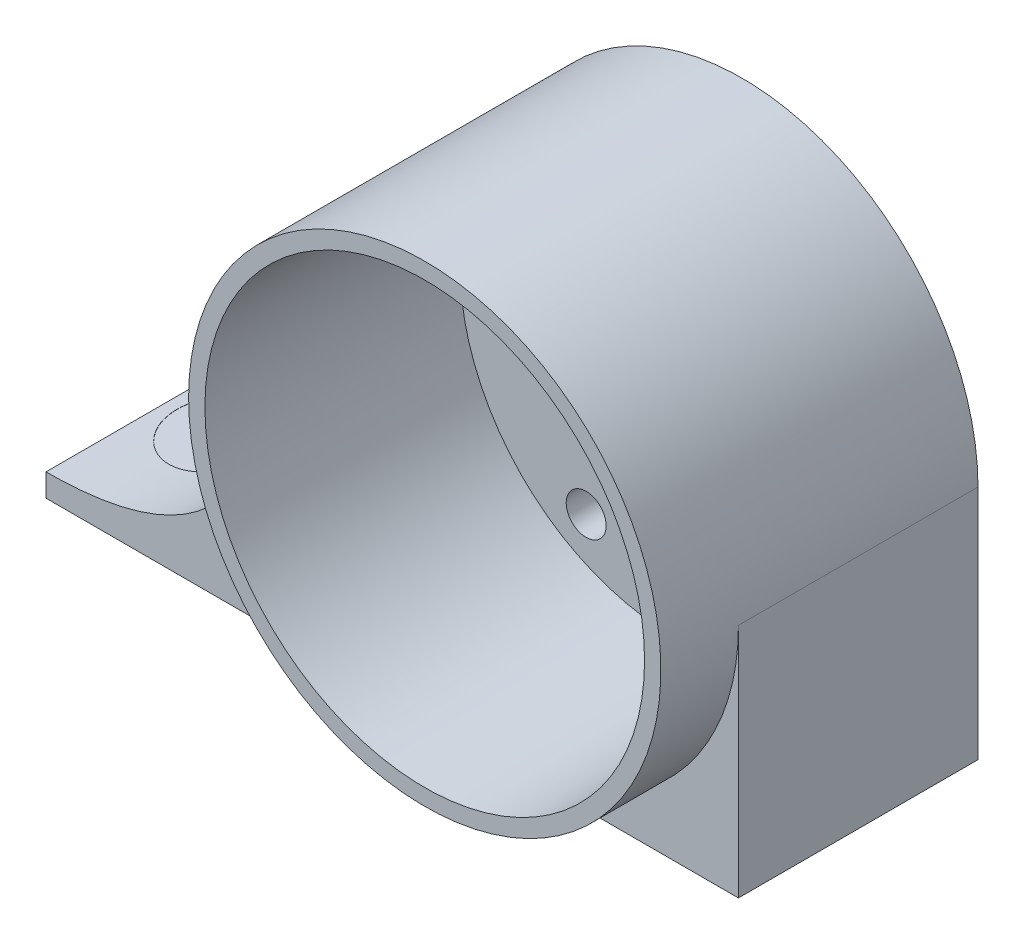
ISO-10303-21;
HEADER;
FILE_DESCRIPTION(('STEP AP214'),'2;1');
FILE_NAME('part.step','',(''),(''),'','','');
FILE_SCHEMA(('AUTOMOTIVE_DESIGN { 1 0 10303 214 1 1 1 1 }'));
ENDSEC;
DATA;
#1=APPLICATION_CONTEXT('core data for automotive mechanical design processes');
#2=APPLICATION_PROTOCOL_DEFINITION('international standard','automotive_design',2000,#1);
#3=PRODUCT_CONTEXT('',#1,'mechanical');
#4=PRODUCT('Part','Part','',(#3));
#5=PRODUCT_RELATED_PRODUCT_CATEGORY('part','',(#4));
#6=PRODUCT_DEFINITION_FORMATION('','',#4);
#7=PRODUCT_DEFINITION_CONTEXT('part definition',#1,'design');
#8=PRODUCT_DEFINITION('design','',#6,#7);
#9=PRODUCT_DEFINITION_SHAPE('','',#8);
#10=(LENGTH_UNIT() NAMED_UNIT(*) SI_UNIT(.MILLI.,.METRE.));
#11=(NAMED_UNIT(*) PLANE_ANGLE_UNIT() SI_UNIT($,.RADIAN.));
#12=(NAMED_UNIT(*) SI_UNIT($,.STERADIAN.) SOLID_ANGLE_UNIT());
#13=UNCERTAINTY_MEASURE_WITH_UNIT(LENGTH_MEASURE(1.E-05),#10,'distance_accuracy_value','');
#14=(GEOMETRIC_REPRESENTATION_CONTEXT(3) GLOBAL_UNCERTAINTY_ASSIGNED_CONTEXT((#13)) GLOBAL_UNIT_ASSIGNED_CONTEXT((#10,
#11,#12)) REPRESENTATION_CONTEXT('',''));
#15=CARTESIAN_POINT('',(0.,0.,0.));
#16=DIRECTION('',(0.,0.,1.));
#17=DIRECTION('',(1.,0.,0.));
#18=AXIS2_PLACEMENT_3D('',#15,#16,#17);
#19=CARTESIAN_POINT('',(7.64999999999997,13.2501886779019,6.));
#20=DIRECTION('',(0.,0.,-1.));
#21=DIRECTION('',(-1.,0.,0.));
#22=AXIS2_PLACEMENT_3D('',#19,#20,#21);
#23=CYLINDRICAL_SURFACE('',#22,1.75);
#24=CARTESIAN_POINT('',(7.64999999999997,13.2501886779019,6.));
#25=DIRECTION('',(0.,0.,1.));
#26=DIRECTION('',(-1.,0.,0.));
#27=AXIS2_PLACEMENT_3D('',#24,#25,#26);
#28=CIRCLE('',#27,1.75);
#29=CARTESIAN_POINT('',(5.89999999999997,13.2501886779019,6.));
#30=VERTEX_POINT('',#29);
#31=EDGE_CURVE('E151',#30,#30,#28,.T.);
#32=ORIENTED_EDGE('',*,*,#31,.T.);
#33=EDGE_LOOP('',(#32));
#34=FACE_BOUND('',#33,.T.);
#35=CARTESIAN_POINT('',(7.64999999999997,13.2501886779019,1.5));
#36=DIRECTION('',(0.,0.,-1.));
#37=DIRECTION('',(-1.,0.,0.));
#38=AXIS2_PLACEMENT_3D('',#35,#36,#37);
#39=CIRCLE('',#38,1.75);
#40=CARTESIAN_POINT('',(5.89999999999997,13.2501886779019,1.5));
#41=VERTEX_POINT('',#40);
#42=EDGE_CURVE('E287',#41,#41,#39,.T.);
#43=ORIENTED_EDGE('',*,*,#42,.T.);
#44=EDGE_LOOP('',(#43));
#45=FACE_BOUND('',#44,.T.);
#46=ADVANCED_FACE('F35',(#34,#45),#23,.F.);
#47=CARTESIAN_POINT('',(15.3,0.,6.));
#48=DIRECTION('',(0.,0.,-1.));
#49=DIRECTION('',(-1.,0.,0.));
#50=AXIS2_PLACEMENT_3D('',#47,#48,#49);
#51=CYLINDRICAL_SURFACE('',#50,1.75);
#52=CARTESIAN_POINT('',(15.3,0.,6.));
#53=DIRECTION('',(0.,0.,1.));
#54=DIRECTION('',(-1.,0.,0.));
#55=AXIS2_PLACEMENT_3D('',#52,#53,#54);
#56=CIRCLE('',#55,1.75);
#57=CARTESIAN_POINT('',(13.55,0.,6.));
#58=VERTEX_POINT('',#57);
#59=EDGE_CURVE('E145',#58,#58,#56,.T.);
#60=ORIENTED_EDGE('',*,*,#59,.T.);
#61=EDGE_LOOP('',(#60));
#62=FACE_BOUND('',#61,.T.);
#63=CARTESIAN_POINT('',(15.3,0.,1.5));
#64=DIRECTION('',(0.,0.,-1.));
#65=DIRECTION('',(-1.,0.,0.));
#66=AXIS2_PLACEMENT_3D('',#63,#64,#65);
#67=CIRCLE('',#66,1.75);
#68=CARTESIAN_POINT('',(13.55,0.,1.5));
#69=VERTEX_POINT('',#68);
#70=EDGE_CURVE('E273',#69,#69,#67,.T.);
#71=ORIENTED_EDGE('',*,*,#70,.T.);
#72=EDGE_LOOP('',(#71));
#73=FACE_BOUND('',#72,.T.);
#74=ADVANCED_FACE('F191',(#62,#73),#51,.F.);
#75=CARTESIAN_POINT('',(-7.64999999999997,-13.2501886779019,6.));
#76=DIRECTION('',(0.,0.,-1.));
#77=DIRECTION('',(-1.,0.,0.));
#78=AXIS2_PLACEMENT_3D('',#75,#76,#77);
#79=CYLINDRICAL_SURFACE('',#78,1.75);
#80=CARTESIAN_POINT('',(-7.64999999999997,-13.2501886779019,6.));
#81=DIRECTION('',(0.,0.,1.));
#82=DIRECTION('',(-1.,0.,0.));
#83=AXIS2_PLACEMENT_3D('',#80,#81,#82);
#84=CIRCLE('',#83,1.75);
#85=CARTESIAN_POINT('',(-9.39999999999997,-13.2501886779019,6.));
#86=VERTEX_POINT('',#85);
#87=EDGE_CURVE('E142',#86,#86,#84,.T.);
#88=ORIENTED_EDGE('',*,*,#87,.T.);
#89=EDGE_LOOP('',(#88));
#90=FACE_BOUND('',#89,.T.);
#91=CARTESIAN_POINT('',(-7.64999999999997,-13.2501886779019,1.5));
#92=DIRECTION('',(0.,0.,-1.));
#93=DIRECTION('',(-1.,0.,0.));
#94=AXIS2_PLACEMENT_3D('',#91,#92,#93);
#95=CIRCLE('',#94,1.75);
#96=CARTESIAN_POINT('',(-9.39999999999997,-13.2501886779019,1.5));
#97=VERTEX_POINT('',#96);
#98=EDGE_CURVE('E264',#97,#97,#95,.T.);
#99=ORIENTED_EDGE('',*,*,#98,.T.);
#100=EDGE_LOOP('',(#99));
#101=FACE_BOUND('',#100,.T.);
#102=ADVANCED_FACE('F197',(#90,#101),#79,.F.);
#103=CARTESIAN_POINT('',(0.,0.,27.8));
#104=DIRECTION('',(0.,0.,-1.));
#105=DIRECTION('',(-1.,0.,0.));
#106=AXIS2_PLACEMENT_3D('',#103,#104,#105);
#107=CYLINDRICAL_SURFACE('',#106,20.7);
#108=DIRECTION('',(0.,0.,-1.));
#109=VECTOR('',#108,1.);
#110=CARTESIAN_POINT('',(-20.7,0.,21.));
#111=LINE('',#110,#109);
#112=CARTESIAN_POINT('',(-20.7,0.,21.));
#113=VERTEX_POINT('',#112);
#114=CARTESIAN_POINT('',(-20.7,0.,0.));
#115=VERTEX_POINT('',#114);
#116=EDGE_CURVE('E116',#113,#115,#111,.T.);
#117=ORIENTED_EDGE('',*,*,#116,.F.);
#118=CARTESIAN_POINT('',(0.,0.,21.));
#119=DIRECTION('',(0.,0.,-1.));
#120=DIRECTION('',(-1.,0.,0.));
#121=AXIS2_PLACEMENT_3D('',#118,#119,#120);
#122=CIRCLE('',#121,20.7);
#123=CARTESIAN_POINT('',(0.,-20.7,21.));
#124=VERTEX_POINT('',#123);
#125=EDGE_CURVE('E103',#124,#113,#122,.T.);
#126=ORIENTED_EDGE('',*,*,#125,.F.);
#127=CARTESIAN_POINT('',(0.,0.,21.));
#128=DIRECTION('',(0.,0.,-1.));
#129=DIRECTION('',(-1.,0.,0.));
#130=AXIS2_PLACEMENT_3D('',#127,#128,#129);
#131=CIRCLE('',#130,20.7);
#132=CARTESIAN_POINT('',(20.7,0.,21.));
#133=VERTEX_POINT('',#132);
#134=EDGE_CURVE('E97',#133,#124,#131,.T.);
#135=ORIENTED_EDGE('',*,*,#134,.F.);
#136=DIRECTION('',(0.,0.,-1.));
#137=VECTOR('',#136,1.);
#138=CARTESIAN_POINT('',(20.7,0.,21.));
#139=LINE('',#138,#137);
#140=CARTESIAN_POINT('',(20.7,0.,0.));
#141=VERTEX_POINT('',#140);
#142=EDGE_CURVE('E52',#133,#141,#139,.T.);
#143=ORIENTED_EDGE('',*,*,#142,.T.);
#144=CARTESIAN_POINT('',(0.,0.,0.));
#145=DIRECTION('',(0.,0.,-1.));
#146=DIRECTION('',(-1.,0.,0.));
#147=AXIS2_PLACEMENT_3D('',#144,#145,#146);
#148=CIRCLE('',#147,20.7);
#149=EDGE_CURVE('E134',#115,#141,#148,.T.);
#150=ORIENTED_EDGE('',*,*,#149,.F.);
#151=EDGE_LOOP('',(#117,#126,#135,#143,#150));
#152=FACE_BOUND('',#151,.T.);
#153=CARTESIAN_POINT('',(0.,0.,27.8));
#154=DIRECTION('',(0.,0.,-1.));
#155=DIRECTION('',(-1.,0.,0.));
#156=AXIS2_PLACEMENT_3D('',#153,#154,#155);
#157=CIRCLE('',#156,20.7);
#158=CARTESIAN_POINT('',(-20.7,0.,27.8));
#159=VERTEX_POINT('',#158);
#160=EDGE_CURVE('E130',#159,#159,#157,.T.);
#161=ORIENTED_EDGE('',*,*,#160,.T.);
#162=EDGE_LOOP('',(#161));
#163=FACE_BOUND('',#162,.T.);
#164=ADVANCED_FACE('F113',(#152,#163),#107,.T.);
#165=CARTESIAN_POINT('',(0.,0.,6.));
#166=DIRECTION('',(0.,0.,1.));
#167=DIRECTION('',(1.,0.,0.));
#168=AXIS2_PLACEMENT_3D('',#165,#166,#167);
#169=PLANE('',#168);
#170=ORIENTED_EDGE('',*,*,#87,.F.);
#171=EDGE_LOOP('',(#170));
#172=FACE_BOUND('',#171,.T.);
#173=CARTESIAN_POINT('',(-15.3,0.,6.));
#174=DIRECTION('',(0.,0.,1.));
#175=DIRECTION('',(1.,0.,0.));
#176=AXIS2_PLACEMENT_3D('',#173,#174,#175);
#177=CIRCLE('',#176,1.75);
#178=CARTESIAN_POINT('',(-13.55,0.,6.));
#179=VERTEX_POINT('',#178);
#180=EDGE_CURVE('E148',#179,#179,#177,.T.);
#181=ORIENTED_EDGE('',*,*,#180,.F.);
#182=EDGE_LOOP('',(#181));
#183=FACE_BOUND('',#182,.T.);
#184=CARTESIAN_POINT('',(-7.64999999999997,13.2501886779019,6.));
#185=DIRECTION('',(0.,0.,1.));
#186=DIRECTION('',(1.,0.,0.));
#187=AXIS2_PLACEMENT_3D('',#184,#185,#186);
#188=CIRCLE('',#187,1.75);
#189=CARTESIAN_POINT('',(-5.89999999999997,13.2501886779019,6.));
#190=VERTEX_POINT('',#189);
#191=EDGE_CURVE('E154',#190,#190,#188,.T.);
#192=ORIENTED_EDGE('',*,*,#191,.F.);
#193=EDGE_LOOP('',(#192));
#194=FACE_BOUND('',#193,.T.);
#195=CARTESIAN_POINT('',(0.,0.,6.));
#196=DIRECTION('',(0.,0.,1.));
#197=DIRECTION('',(1.,0.,0.));
#198=AXIS2_PLACEMENT_3D('',#195,#196,#197);
#199=CIRCLE('',#198,18.7);
#200=CARTESIAN_POINT('',(18.7,0.,6.));
#201=VERTEX_POINT('',#200);
#202=EDGE_CURVE('E133',#201,#201,#199,.T.);
#203=ORIENTED_EDGE('',*,*,#202,.T.);
#204=EDGE_LOOP('',(#203));
#205=FACE_BOUND('',#204,.T.);
#206=CARTESIAN_POINT('',(0.,-7.,6.));
#207=DIRECTION('',(0.,0.,1.));
#208=DIRECTION('',(1.,0.,0.));
#209=AXIS2_PLACEMENT_3D('',#206,#207,#208);
#210=CIRCLE('',#209,6.1);
#211=CARTESIAN_POINT('',(6.1,-7.,6.));
#212=VERTEX_POINT('',#211);
#213=EDGE_CURVE('E11',#212,#212,#210,.T.);
#214=ORIENTED_EDGE('',*,*,#213,.F.);
#215=EDGE_LOOP('',(#214));
#216=FACE_BOUND('',#215,.T.);
#217=ORIENTED_EDGE('',*,*,#31,.F.);
#218=EDGE_LOOP('',(#217));
#219=FACE_BOUND('',#218,.T.);
#220=ORIENTED_EDGE('',*,*,#59,.F.);
#221=EDGE_LOOP('',(#220));
#222=FACE_BOUND('',#221,.T.);
#223=CARTESIAN_POINT('',(7.64999999999997,-13.2501886779019,6.));
#224=DIRECTION('',(0.,0.,1.));
#225=DIRECTION('',(1.,0.,0.));
#226=AXIS2_PLACEMENT_3D('',#223,#224,#225);
#227=CIRCLE('',#226,1.75);
#228=CARTESIAN_POINT('',(9.39999999999997,-13.2501886779019,6.));
#229=VERTEX_POINT('',#228);
#230=EDGE_CURVE('E139',#229,#229,#227,.T.);
#231=ORIENTED_EDGE('',*,*,#230,.F.);
#232=EDGE_LOOP('',(#231));
#233=FACE_BOUND('',#232,.T.);
#234=ADVANCED_FACE('F213',(#172,#183,#194,#205,#216,#219,#222,#233),#169,.T.);
#235=CARTESIAN_POINT('',(0.,0.,0.));
#236=DIRECTION('',(0.,0.,1.));
#237=DIRECTION('',(1.,0.,0.));
#238=AXIS2_PLACEMENT_3D('',#235,#236,#237);
#239=PLANE('',#238);
#240=CARTESIAN_POINT('',(-7.64999999999997,-13.2501886779019,0.));
#241=DIRECTION('',(0.,0.,-1.));
#242=DIRECTION('',(-1.,0.,0.));
#243=AXIS2_PLACEMENT_3D('',#240,#241,#242);
#244=CIRCLE('',#243,2.7747070207126);
#245=CARTESIAN_POINT('',(-10.4247070207126,-13.2501886779019,0.));
#246=VERTEX_POINT('',#245);
#247=EDGE_CURVE('E225',#246,#246,#244,.T.);
#248=ORIENTED_EDGE('',*,*,#247,.F.);
#249=EDGE_LOOP('',(#248));
#250=FACE_BOUND('',#249,.T.);
#251=CARTESIAN_POINT('',(-15.3,0.,0.));
#252=DIRECTION('',(0.,0.,-1.));
#253=DIRECTION('',(1.,0.,0.));
#254=AXIS2_PLACEMENT_3D('',#251,#252,#253);
#255=CIRCLE('',#254,2.7747070207126);
#256=CARTESIAN_POINT('',(-12.5252929792874,0.,0.));
#257=VERTEX_POINT('',#256);
#258=EDGE_CURVE('E229',#257,#257,#255,.T.);
#259=ORIENTED_EDGE('',*,*,#258,.F.);
#260=EDGE_LOOP('',(#259));
#261=FACE_BOUND('',#260,.T.);
#262=CARTESIAN_POINT('',(15.3,0.,0.));
#263=DIRECTION('',(0.,0.,-1.));
#264=DIRECTION('',(-1.,0.,0.));
#265=AXIS2_PLACEMENT_3D('',#262,#263,#264);
#266=CIRCLE('',#265,2.7747070207126);
#267=CARTESIAN_POINT('',(12.5252929792874,0.,0.));
#268=VERTEX_POINT('',#267);
#269=EDGE_CURVE('E233',#268,#268,#266,.T.);
#270=ORIENTED_EDGE('',*,*,#269,.F.);
#271=EDGE_LOOP('',(#270));
#272=FACE_BOUND('',#271,.T.);
#273=CARTESIAN_POINT('',(-7.64999999999997,13.2501886779019,0.));
#274=DIRECTION('',(0.,0.,-1.));
#275=DIRECTION('',(1.,0.,0.));
#276=AXIS2_PLACEMENT_3D('',#273,#274,#275);
#277=CIRCLE('',#276,2.7747070207126);
#278=CARTESIAN_POINT('',(-4.87529297928737,13.2501886779019,0.));
#279=VERTEX_POINT('',#278);
#280=EDGE_CURVE('E237',#279,#279,#277,.T.);
#281=ORIENTED_EDGE('',*,*,#280,.F.);
#282=EDGE_LOOP('',(#281));
#283=FACE_BOUND('',#282,.T.);
#284=CARTESIAN_POINT('',(7.64999999999997,-13.2501886779019,0.));
#285=DIRECTION('',(0.,0.,-1.));
#286=DIRECTION('',(1.,0.,0.));
#287=AXIS2_PLACEMENT_3D('',#284,#285,#286);
#288=CIRCLE('',#287,2.7747070207126);
#289=CARTESIAN_POINT('',(10.4247070207126,-13.2501886779019,0.));
#290=VERTEX_POINT('',#289);
#291=EDGE_CURVE('E241',#290,#290,#288,.T.);
#292=ORIENTED_EDGE('',*,*,#291,.F.);
#293=EDGE_LOOP('',(#292));
#294=FACE_BOUND('',#293,.T.);
#295=CARTESIAN_POINT('',(7.64999999999997,13.2501886779019,0.));
#296=DIRECTION('',(0.,0.,-1.));
#297=DIRECTION('',(-1.,0.,0.));
#298=AXIS2_PLACEMENT_3D('',#295,#296,#297);
#299=CIRCLE('',#298,2.7747070207126);
#300=CARTESIAN_POINT('',(4.87529297928737,13.2501886779019,0.));
#301=VERTEX_POINT('',#300);
#302=EDGE_CURVE('E245',#301,#301,#299,.T.);
#303=ORIENTED_EDGE('',*,*,#302,.F.);
#304=EDGE_LOOP('',(#303));
#305=FACE_BOUND('',#304,.T.);
#306=CARTESIAN_POINT('',(0.,-7.,0.));
#307=DIRECTION('',(0.,0.,1.));
#308=DIRECTION('',(1.,0.,0.));
#309=AXIS2_PLACEMENT_3D('',#306,#307,#308);
#310=CIRCLE('',#309,6.1);
#311=CARTESIAN_POINT('',(6.1,-7.,0.));
#312=VERTEX_POINT('',#311);
#313=EDGE_CURVE('E44',#312,#312,#310,.T.);
#314=ORIENTED_EDGE('',*,*,#313,.T.);
#315=EDGE_LOOP('',(#314));
#316=FACE_BOUND('',#315,.T.);
#317=ORIENTED_EDGE('',*,*,#149,.T.);
#318=DIRECTION('',(0.,-1.,0.));
#319=VECTOR('',#318,1.);
#320=CARTESIAN_POINT('',(20.7,0.,0.));
#321=LINE('',#320,#319);
#322=CARTESIAN_POINT('',(20.7,-20.7,0.));
#323=VERTEX_POINT('',#322);
#324=EDGE_CURVE('E249',#141,#323,#321,.T.);
#325=ORIENTED_EDGE('',*,*,#324,.T.);
#326=DIRECTION('',(-1.,0.,0.));
#327=VECTOR('',#326,1.);
#328=CARTESIAN_POINT('',(0.,-20.7,0.));
#329=LINE('',#328,#327);
#330=CARTESIAN_POINT('',(-40.,-20.7,0.));
#331=VERTEX_POINT('',#330);
#332=EDGE_CURVE('E117',#323,#331,#329,.T.);
#333=ORIENTED_EDGE('',*,*,#332,.T.);
#334=DIRECTION('',(0.,-1.,0.));
#335=VECTOR('',#334,1.);
#336=CARTESIAN_POINT('',(-40.,0.,0.));
#337=LINE('',#336,#335);
#338=CARTESIAN_POINT('',(-40.,-18.7,0.));
#339=VERTEX_POINT('',#338);
#340=EDGE_CURVE('E61',#339,#331,#337,.T.);
#341=ORIENTED_EDGE('',*,*,#340,.F.);
#342=CARTESIAN_POINT('',(-20.7,0.,0.));
#343=CARTESIAN_POINT('',(-20.7,-18.7,0.));
#344=CARTESIAN_POINT('',(-40.,-18.7,0.));
#345=B_SPLINE_CURVE_WITH_KNOTS('',2,(#342,#343,#344),.UNSPECIFIED.,.F.,.F.,(3,3),(0.,1.),.UNSPECIFIED.);
#346=EDGE_CURVE('E251',#115,#339,#345,.T.);
#347=ORIENTED_EDGE('',*,*,#346,.F.);
#348=EDGE_LOOP('',(#317,#325,#333,#341,#347));
#349=FACE_BOUND('',#348,.T.);
#350=ADVANCED_FACE('F211',(#250,#261,#272,#283,#294,#305,#316,#349),#239,.F.);
#351=CARTESIAN_POINT('',(0.,-7.,6.));
#352=DIRECTION('',(0.,0.,-1.));
#353=DIRECTION('',(-1.,0.,0.));
#354=AXIS2_PLACEMENT_3D('',#351,#352,#353);
#355=CYLINDRICAL_SURFACE('',#354,6.1);
#356=ORIENTED_EDGE('',*,*,#213,.T.);
#357=EDGE_LOOP('',(#356));
#358=FACE_BOUND('',#357,.T.);
#359=ORIENTED_EDGE('',*,*,#313,.F.);
#360=EDGE_LOOP('',(#359));
#361=FACE_BOUND('',#360,.T.);
#362=ADVANCED_FACE('F207',(#358,#361),#355,.F.);
#363=CARTESIAN_POINT('',(-7.64999999999997,13.2501886779019,6.));
#364=DIRECTION('',(0.,0.,-1.));
#365=DIRECTION('',(-1.,0.,0.));
#366=AXIS2_PLACEMENT_3D('',#363,#364,#365);
#367=CYLINDRICAL_SURFACE('',#366,1.75);
#368=CARTESIAN_POINT('',(-7.64999999999997,13.2501886779019,1.5));
#369=DIRECTION('',(0.,0.,-1.));
#370=DIRECTION('',(1.,0.,0.));
#371=AXIS2_PLACEMENT_3D('',#368,#369,#370);
#372=CIRCLE('',#371,1.75);
#373=CARTESIAN_POINT('',(-5.89999999999997,13.2501886779019,1.5));
#374=VERTEX_POINT('',#373);
#375=EDGE_CURVE('E280',#374,#374,#372,.T.);
#376=ORIENTED_EDGE('',*,*,#375,.T.);
#377=EDGE_LOOP('',(#376));
#378=FACE_BOUND('',#377,.T.);
#379=ORIENTED_EDGE('',*,*,#191,.T.);
#380=EDGE_LOOP('',(#379));
#381=FACE_BOUND('',#380,.T.);
#382=ADVANCED_FACE('F204',(#378,#381),#367,.F.);
#383=CARTESIAN_POINT('',(-15.3,0.,6.));
#384=DIRECTION('',(0.,0.,-1.));
#385=DIRECTION('',(-1.,0.,0.));
#386=AXIS2_PLACEMENT_3D('',#383,#384,#385);
#387=CYLINDRICAL_SURFACE('',#386,1.75);
#388=CARTESIAN_POINT('',(-15.3,0.,1.5));
#389=DIRECTION('',(0.,0.,-1.));
#390=DIRECTION('',(1.,0.,0.));
#391=AXIS2_PLACEMENT_3D('',#388,#389,#390);
#392=CIRCLE('',#391,1.75);
#393=CARTESIAN_POINT('',(-13.55,0.,1.5));
#394=VERTEX_POINT('',#393);
#395=EDGE_CURVE('E266',#394,#394,#392,.T.);
#396=ORIENTED_EDGE('',*,*,#395,.T.);
#397=EDGE_LOOP('',(#396));
#398=FACE_BOUND('',#397,.T.);
#399=ORIENTED_EDGE('',*,*,#180,.T.);
#400=EDGE_LOOP('',(#399));
#401=FACE_BOUND('',#400,.T.);
#402=ADVANCED_FACE('F203',(#398,#401),#387,.F.);
#403=CARTESIAN_POINT('',(7.64999999999997,-13.2501886779019,6.));
#404=DIRECTION('',(0.,0.,-1.));
#405=DIRECTION('',(-1.,0.,0.));
#406=AXIS2_PLACEMENT_3D('',#403,#404,#405);
#407=CYLINDRICAL_SURFACE('',#406,1.75);
#408=CARTESIAN_POINT('',(7.64999999999997,-13.2501886779019,1.5));
#409=DIRECTION('',(0.,0.,-1.));
#410=DIRECTION('',(1.,0.,0.));
#411=AXIS2_PLACEMENT_3D('',#408,#409,#410);
#412=CIRCLE('',#411,1.75);
#413=CARTESIAN_POINT('',(9.39999999999997,-13.2501886779019,1.5));
#414=VERTEX_POINT('',#413);
#415=EDGE_CURVE('E258',#414,#414,#412,.T.);
#416=ORIENTED_EDGE('',*,*,#415,.T.);
#417=EDGE_LOOP('',(#416));
#418=FACE_BOUND('',#417,.T.);
#419=ORIENTED_EDGE('',*,*,#230,.T.);
#420=EDGE_LOOP('',(#419));
#421=FACE_BOUND('',#420,.T.);
#422=ADVANCED_FACE('F329',(#418,#421),#407,.F.);
#423=CARTESIAN_POINT('',(0.,0.,27.8));
#424=DIRECTION('',(0.,0.,-1.));
#425=DIRECTION('',(-1.,0.,0.));
#426=AXIS2_PLACEMENT_3D('',#423,#424,#425);
#427=PLANE('',#426);
#428=CARTESIAN_POINT('',(0.,0.,27.8));
#429=DIRECTION('',(0.,0.,-1.));
#430=DIRECTION('',(-1.,0.,0.));
#431=AXIS2_PLACEMENT_3D('',#428,#429,#430);
#432=CIRCLE('',#431,19.2708530902083);
#433=CARTESIAN_POINT('',(-19.2708530902083,0.,27.8));
#434=VERTEX_POINT('',#433);
#435=EDGE_CURVE('E39',#434,#434,#432,.T.);
#436=ORIENTED_EDGE('',*,*,#435,.T.);
#437=EDGE_LOOP('',(#436));
#438=FACE_BOUND('',#437,.T.);
#439=ORIENTED_EDGE('',*,*,#160,.F.);
#440=EDGE_LOOP('',(#439));
#441=FACE_BOUND('',#440,.T.);
#442=ADVANCED_FACE('F326',(#438,#441),#427,.F.);
#443=CARTESIAN_POINT('',(0.,0.,6.));
#444=DIRECTION('',(0.,0.,1.));
#445=DIRECTION('',(1.,0.,0.));
#446=AXIS2_PLACEMENT_3D('',#443,#444,#445);
#447=CONICAL_SURFACE('',#446,18.7,0.026179938779915);
#448=ORIENTED_EDGE('',*,*,#202,.F.);
#449=EDGE_LOOP('',(#448));
#450=FACE_BOUND('',#449,.T.);
#451=ORIENTED_EDGE('',*,*,#435,.F.);
#452=EDGE_LOOP('',(#451));
#453=FACE_BOUND('',#452,.T.);
#454=ADVANCED_FACE('F37',(#450,#453),#447,.F.);
#455=CARTESIAN_POINT('',(0.,-20.7,21.));
#456=DIRECTION('',(0.,-1.,0.));
#457=DIRECTION('',(1.,0.,0.));
#458=AXIS2_PLACEMENT_3D('',#455,#456,#457);
#459=PLANE('',#458);
#460=DIRECTION('',(0.,0.,1.));
#461=VECTOR('',#460,1.);
#462=CARTESIAN_POINT('',(20.7,-20.7,0.));
#463=LINE('',#462,#461);
#464=CARTESIAN_POINT('',(20.7,-20.7,21.));
#465=VERTEX_POINT('',#464);
#466=EDGE_CURVE('E94',#323,#465,#463,.T.);
#467=ORIENTED_EDGE('',*,*,#466,.T.);
#468=DIRECTION('',(-1.,0.,0.));
#469=VECTOR('',#468,1.);
#470=CARTESIAN_POINT('',(0.,-20.7,21.));
#471=LINE('',#470,#469);
#472=EDGE_CURVE('E86',#465,#124,#471,.T.);
#473=ORIENTED_EDGE('',*,*,#472,.T.);
#474=DIRECTION('',(-1.,0.,0.));
#475=VECTOR('',#474,1.);
#476=CARTESIAN_POINT('',(0.,-20.7,21.));
#477=LINE('',#476,#475);
#478=CARTESIAN_POINT('',(-40.,-20.7,21.));
#479=VERTEX_POINT('',#478);
#480=EDGE_CURVE('E91',#124,#479,#477,.T.);
#481=ORIENTED_EDGE('',*,*,#480,.T.);
#482=DIRECTION('',(0.,0.,-1.));
#483=VECTOR('',#482,1.);
#484=CARTESIAN_POINT('',(-40.,-20.7,21.));
#485=LINE('',#484,#483);
#486=EDGE_CURVE('E107',#479,#331,#485,.T.);
#487=ORIENTED_EDGE('',*,*,#486,.T.);
#488=ORIENTED_EDGE('',*,*,#332,.F.);
#489=EDGE_LOOP('',(#467,#473,#481,#487,#488));
#490=FACE_BOUND('',#489,.T.);
#491=CARTESIAN_POINT('',(-34.,-20.7,10.5));
#492=DIRECTION('',(0.,-1.,0.));
#493=DIRECTION('',(1.,0.,0.));
#494=AXIS2_PLACEMENT_3D('',#491,#492,#493);
#495=CIRCLE('',#494,2.25);
#496=CARTESIAN_POINT('',(-31.75,-20.7,10.5));
#497=VERTEX_POINT('',#496);
#498=EDGE_CURVE('E169',#497,#497,#495,.T.);
#499=ORIENTED_EDGE('',*,*,#498,.F.);
#500=EDGE_LOOP('',(#499));
#501=FACE_BOUND('',#500,.T.);
#502=ADVANCED_FACE('F88',(#490,#501),#459,.T.);
#503=CARTESIAN_POINT('',(0.,0.,21.));
#504=DIRECTION('',(0.,0.,-1.));
#505=DIRECTION('',(-1.,0.,0.));
#506=AXIS2_PLACEMENT_3D('',#503,#504,#505);
#507=PLANE('',#506);
#508=ORIENTED_EDGE('',*,*,#472,.F.);
#509=DIRECTION('',(0.,-1.,0.));
#510=VECTOR('',#509,1.);
#511=CARTESIAN_POINT('',(20.7,0.,21.));
#512=LINE('',#511,#510);
#513=EDGE_CURVE('E120',#133,#465,#512,.T.);
#514=ORIENTED_EDGE('',*,*,#513,.F.);
#515=ORIENTED_EDGE('',*,*,#134,.T.);
#516=EDGE_LOOP('',(#508,#514,#515));
#517=FACE_BOUND('',#516,.T.);
#518=ADVANCED_FACE('F119',(#517),#507,.F.);
#519=CARTESIAN_POINT('',(-20.7,0.,21.));
#520=CARTESIAN_POINT('',(-20.7,-18.7,21.));
#521=CARTESIAN_POINT('',(-40.,-18.7,21.));
#522=B_SPLINE_CURVE_WITH_KNOTS('',2,(#519,#520,#521),.UNSPECIFIED.,.F.,.F.,(3,3),(0.,1.),.UNSPECIFIED.);
#523=DIRECTION('',(0.,0.,-1.));
#524=VECTOR('',#523,1.);
#525=SURFACE_OF_LINEAR_EXTRUSION('',#522,#524);
#526=CARTESIAN_POINT('',(-29.,-16.4843287012857,10.5));
#527=CARTESIAN_POINT('',(-28.9999960240652,-16.4843249148218,10.6314247806073));
#528=CARTESIAN_POINT('',(-29.0051844611352,-16.4869685118528,10.7628113156223));
#529=CARTESIAN_POINT('',(-29.0258646646306,-16.4974582963658,11.024601195567));
#530=CARTESIAN_POINT('',(-29.0413581367008,-16.5053053450999,11.1550043741217));
#531=CARTESIAN_POINT('',(-29.0824768593926,-16.5259915912863,11.4138693709225));
#532=CARTESIAN_POINT('',(-29.1081079447605,-16.5388336635748,11.5423300268569));
#533=CARTESIAN_POINT('',(-29.1692146175473,-16.5691661550488,11.7963754797653));
#534=CARTESIAN_POINT('',(-29.2046941392538,-16.5866584317958,11.9219591056639));
#535=CARTESIAN_POINT('',(-29.2849584719708,-16.6257667770122,12.1688810483096));
#536=CARTESIAN_POINT('',(-29.3297050531472,-16.6473658743453,12.2902344857018));
#537=CARTESIAN_POINT('',(-29.428162558616,-16.6942280546712,12.528533500877));
#538=CARTESIAN_POINT('',(-29.4818768552552,-16.7194925155692,12.6454774000779));
#539=CARTESIAN_POINT('',(-29.6557805672584,-16.7999647603197,12.9886570864301));
#540=CARTESIAN_POINT('',(-29.7887996781999,-16.8598860309829,13.2074505334886));
#541=CARTESIAN_POINT('',(-30.0941225312814,-16.9916721401808,13.6332089995753));
#542=CARTESIAN_POINT('',(-30.2683267420052,-17.0640423824084,13.8386399068324));
#543=CARTESIAN_POINT('',(-30.6465943536489,-17.212985192609,14.2183889904269));
#544=CARTESIAN_POINT('',(-30.8506680663133,-17.2895592061069,14.392696375779));
#545=CARTESIAN_POINT('',(-31.1841036957584,-17.407302121805,14.6342013807866));
#546=CARTESIAN_POINT('',(-31.3046631720632,-17.4485580746027,14.7137917641327));
#547=CARTESIAN_POINT('',(-31.5523561503791,-17.5304525253065,14.8623233101145));
#548=CARTESIAN_POINT('',(-31.6794874693439,-17.5710912225232,14.9312679791043));
#549=CARTESIAN_POINT('',(-31.9395921670546,-17.6512457850526,15.0580332606384));
#550=CARTESIAN_POINT('',(-32.0725682700513,-17.6907611123249,15.1158486168082));
#551=CARTESIAN_POINT('',(-32.3433966726922,-17.7681783562409,15.2198191533485));
#552=CARTESIAN_POINT('',(-32.4812469649361,-17.8060809232385,15.2659790716067));
#553=CARTESIAN_POINT('',(-32.7615194405298,-17.880051260156,15.346391253413));
#554=CARTESIAN_POINT('',(-32.9039581840598,-17.9161107873562,15.3805934451246));
#555=CARTESIAN_POINT('',(-33.191785523894,-17.9858884721273,15.4364228010944));
#556=CARTESIAN_POINT('',(-33.3371729493313,-18.0196075364102,15.4580548593248));
#557=CARTESIAN_POINT('',(-33.6298604351155,-18.084470378399,15.4884510583904));
#558=CARTESIAN_POINT('',(-33.7771605177133,-18.1156141261137,15.4972150493887));
#559=CARTESIAN_POINT('',(-34.0725117415801,-18.1751504817972,15.5016549652962));
#560=CARTESIAN_POINT('',(-34.2205628539002,-18.203543194971,15.4973313909038));
#561=CARTESIAN_POINT('',(-34.5103946772282,-18.2564174995064,15.47591957995));
#562=CARTESIAN_POINT('',(-34.6521930672595,-18.2810089720529,15.4593398780624));
#563=CARTESIAN_POINT('',(-34.9343257543013,-18.3275448871093,15.4140059596126));
#564=CARTESIAN_POINT('',(-35.0746595255452,-18.3494884070261,15.3852475154097));
#565=CARTESIAN_POINT('',(-35.3526313575624,-18.3907393791088,15.315693623135));
#566=CARTESIAN_POINT('',(-35.4902707346322,-18.4100481474287,15.2749042173983));
#567=CARTESIAN_POINT('',(-35.7618769673121,-18.4461330160014,15.1814975997188));
#568=CARTESIAN_POINT('',(-35.8958424683971,-18.4629081921486,15.1288760894524));
#569=CARTESIAN_POINT('',(-36.1550644166782,-18.4935836990553,15.0138899868631));
#570=CARTESIAN_POINT('',(-36.2804613133538,-18.5075545169219,14.9518605060422));
#571=CARTESIAN_POINT('',(-36.5258264211081,-18.5333793880363,14.8173810926165));
#572=CARTESIAN_POINT('',(-36.6457926514692,-18.545232673531,14.7449273976266));
#573=CARTESIAN_POINT('',(-36.8792912557419,-18.5669864024153,14.5901459566543));
#574=CARTESIAN_POINT('',(-36.9928262620358,-18.5768876489764,14.5078222942107));
#575=CARTESIAN_POINT('',(-37.2127049744437,-18.5949382009711,14.333821798431));
#576=CARTESIAN_POINT('',(-37.3190460074821,-18.6030868576165,14.2421415198407));
#577=CARTESIAN_POINT('',(-37.5229958954714,-18.6177776975151,14.0507634923676));
#578=CARTESIAN_POINT('',(-37.6206596111627,-18.6243305099694,13.9511250097793));
#579=CARTESIAN_POINT('',(-37.8073895465767,-18.6361021132365,13.7439542065406));
#580=CARTESIAN_POINT('',(-37.8964526032298,-18.6413204144094,13.6364190071125));
#581=CARTESIAN_POINT('',(-38.0652659131065,-18.650612174979,13.4142865938128));
#582=CARTESIAN_POINT('',(-38.1450194866752,-18.654686043286,13.2996919202082));
#583=CARTESIAN_POINT('',(-38.2947063061741,-18.6618761185264,13.0641712906221));
#584=CARTESIAN_POINT('',(-38.36463590571,-18.6649919703774,12.9432430065184));
#585=CARTESIAN_POINT('',(-38.4943354054026,-18.6704402477962,12.6955744589474));
#586=CARTESIAN_POINT('',(-38.5540741616961,-18.6727702923586,12.5688178308791));
#587=CARTESIAN_POINT('',(-38.6627285671546,-18.6767841155475,12.3106856763704));
#588=CARTESIAN_POINT('',(-38.7116402096374,-18.678467655097,12.1793084608079));
#589=CARTESIAN_POINT('',(-38.7982480880169,-18.6813130418711,11.9129438859742));
#590=CARTESIAN_POINT('',(-38.8359483011404,-18.6824750741738,11.7779578254973));
#591=CARTESIAN_POINT('',(-38.8999033247364,-18.6843756858135,11.5052839804499));
#592=CARTESIAN_POINT('',(-38.9261539004125,-18.685114108505,11.3675952158921));
#593=CARTESIAN_POINT('',(-38.9874827197671,-18.6868102625884,10.9512717139973));
#594=CARTESIAN_POINT('',(-39.0049926743541,-18.6872446940613,10.6698278955275));
#595=CARTESIAN_POINT('',(-38.9925421661542,-18.6869173800415,10.1081425691696));
#596=CARTESIAN_POINT('',(-38.9625813564337,-18.6861556258066,9.82790107008355));
#597=CARTESIAN_POINT('',(-38.8560551765422,-18.6831093870709,9.27621480889146));
#598=CARTESIAN_POINT('',(-38.7794621310695,-18.6808239982467,9.00477537146832));
#599=CARTESIAN_POINT('',(-38.5818193820486,-18.67392136282,8.47863417296254));
#600=CARTESIAN_POINT('',(-38.4607696189696,-18.6693041130949,8.22393243429348));
#601=CARTESIAN_POINT('',(-38.1777871459836,-18.656522544217,7.73867368949466));
#602=CARTESIAN_POINT('',(-38.0158817145908,-18.6483605891814,7.50810071781557));
#603=CARTESIAN_POINT('',(-37.6558455680872,-18.6269848960959,7.0774935809204));
#604=CARTESIAN_POINT('',(-37.4577156871126,-18.6137712743623,6.87745871270163));
#605=CARTESIAN_POINT('',(-37.0316945667629,-18.5807161579841,6.5141541229157));
#606=CARTESIAN_POINT('',(-36.8038919560294,-18.5608941372304,6.35077871108925));
#607=CARTESIAN_POINT('',(-36.324876090572,-18.5130960739219,6.06459908843734));
#608=CARTESIAN_POINT('',(-36.0736640789331,-18.485120464171,5.94179272488843));
#609=CARTESIAN_POINT('',(-35.5562188686402,-18.4199368774617,5.74027024103748));
#610=CARTESIAN_POINT('',(-35.290036606283,-18.3827588980878,5.66141351868391));
#611=CARTESIAN_POINT('',(-34.7498293192402,-18.2985206521375,5.5488496612571));
#612=CARTESIAN_POINT('',(-34.4758042429502,-18.2514603205241,5.51514282333157));
#613=CARTESIAN_POINT('',(-33.9258065665291,-18.1472275873258,5.49292478758853));
#614=CARTESIAN_POINT('',(-33.6498343049934,-18.0899840931863,5.50474425896372));
#615=CARTESIAN_POINT('',(-33.1055150755971,-17.966658491927,5.57301583036324));
#616=CARTESIAN_POINT('',(-32.837169125925,-17.900575211267,5.62947386134833));
#617=CARTESIAN_POINT('',(-32.3072928212774,-17.7594891932835,5.78689603504213));
#618=CARTESIAN_POINT('',(-32.0461878221423,-17.6842829086152,5.889107099437));
#619=CARTESIAN_POINT('',(-31.5455929541792,-17.5296310028316,6.13494708446015));
#620=CARTESIAN_POINT('',(-31.3061090406583,-17.4501842232455,6.27858737092152));
#621=CARTESIAN_POINT('',(-30.845426557697,-17.2879048846462,6.60996462290248));
#622=CARTESIAN_POINT('',(-30.6253223126562,-17.2050624198743,6.79921788214885));
#623=CARTESIAN_POINT('',(-30.2200190518954,-17.0444820679815,7.21430520036162));
#624=CARTESIAN_POINT('',(-30.034834243332,-16.9667462668789,7.4401540792644));
#625=CARTESIAN_POINT('',(-29.7877250156919,-16.8588338369437,7.80218878898729));
#626=CARTESIAN_POINT('',(-29.7104237948503,-16.8242907047504,7.92683815823347));
#627=CARTESIAN_POINT('',(-29.5667298650327,-16.758934129378,8.18317699961162));
#628=CARTESIAN_POINT('',(-29.5003319977612,-16.7281189243714,8.31486310340689));
#629=CARTESIAN_POINT('',(-29.3792119390974,-16.671081214817,8.58424903781866));
#630=CARTESIAN_POINT('',(-29.3244748268368,-16.6448528488366,8.72194090829962));
#631=CARTESIAN_POINT('',(-29.227239833377,-16.5977305386713,9.00240585361993));
#632=CARTESIAN_POINT('',(-29.1847377758973,-16.5768347745476,9.14517717591176));
#633=CARTESIAN_POINT('',(-29.0995741519788,-16.5346375360183,9.48664922889382));
#634=CARTESIAN_POINT('',(-29.0623195140668,-16.5158769796617,9.68704882938799));
#635=CARTESIAN_POINT('',(-29.0125378427855,-16.4907266619681,10.0916635209997));
#636=CARTESIAN_POINT('',(-29.0000061752144,-16.4843345822239,10.2958778898113));
#637=CARTESIAN_POINT('',(-29.,-16.4843287012857,10.5));
#638=B_SPLINE_CURVE_WITH_KNOTS('',3,(#526,#527,#528,#529,#530,#531,#532,#533,#534,#535,#536,
#537,#538,#539,#540,#541,#542,#543,#544,#545,#546,#547,#548,#549,#550,#551,#552,#553,#554,#555,
#556,#557,#558,#559,#560,#561,#562,#563,#564,#565,#566,#567,#568,#569,#570,#571,#572,#573,#574,
#575,#576,#577,#578,#579,#580,#581,#582,#583,#584,#585,#586,#587,#588,#589,#590,#591,#592,#593,
#594,#595,#596,#597,#598,#599,#600,#601,#602,#603,#604,#605,#606,#607,#608,#609,#610,#611,#612,
#613,#614,#615,#616,#617,#618,#619,#620,#621,#622,#623,#624,#625,#626,#627,#628,#629,#630,#631,
#632,#633,#634,#635,#636,#637),.UNSPECIFIED.,.T.,.F.,(4,2,2,2,2,2,2,2,2,2,2,2,2,2,2,2,2,2,2,2,2,
2,2,2,2,2,2,2,2,2,2,2,2,2,2,2,2,2,2,2,2,2,2,2,2,2,2,2,2,2,2,2,2,2,2,4),(0.,0.394080235302993,
0.788225713297748,1.1825983742749,1.57712880790846,1.97006297840851,2.36314524765115,
3.14864725553748,3.98203321578815,4.81570756456371,5.26598120011495,5.71610621228536,
6.1664432996863,6.61659703113434,7.06861377574754,7.52045441705272,7.97230031958995,
8.42412893582283,8.85819359402195,9.29240905395904,9.72640680721198,10.1605624770342,
10.5818464989485,11.0032829570593,11.424545650507,11.8459640230577,12.264493646026,
12.6831766103159,13.1017097867639,13.5203979032953,13.9403434850941,14.3604442131381,
14.7803957332216,15.2005024463608,16.0421115477453,16.8837267999427,17.7258420215523,
18.5679583708221,19.409513936686,20.2510501265902,21.090128047163,21.9291614364235,
22.7654949834052,23.6018340345731,24.444259044161,25.2867960024659,26.1538426729642,
27.0211274386084,27.9226326099499,28.8245037757463,29.2760641283122,29.7274102317001,
30.178175285809,30.6287862940559,31.2409659095386,31.85303076399),.UNSPECIFIED.);
#639=CARTESIAN_POINT('',(-29.,-16.4843287012857,10.5));
#640=VERTEX_POINT('',#639);
#641=EDGE_CURVE('E161',#640,#640,#638,.T.);
#642=ORIENTED_EDGE('',*,*,#641,.T.);
#643=EDGE_LOOP('',(#642));
#644=FACE_BOUND('',#643,.T.);
#645=ORIENTED_EDGE('',*,*,#346,.T.);
#646=DIRECTION('',(0.,0.,-1.));
#647=VECTOR('',#646,1.);
#648=CARTESIAN_POINT('',(-40.,-18.7,21.));
#649=LINE('',#648,#647);
#650=CARTESIAN_POINT('',(-40.,-18.7,21.));
#651=VERTEX_POINT('',#650);
#652=EDGE_CURVE('E108',#651,#339,#649,.T.);
#653=ORIENTED_EDGE('',*,*,#652,.F.);
#654=EDGE_CURVE('E124',#113,#651,#522,.T.);
#655=ORIENTED_EDGE('',*,*,#654,.F.);
#656=ORIENTED_EDGE('',*,*,#116,.T.);
#657=EDGE_LOOP('',(#645,#653,#655,#656));
#658=FACE_BOUND('',#657,.T.);
#659=ADVANCED_FACE('F170',(#644,#658),#525,.F.);
#660=CARTESIAN_POINT('',(-40.,0.,21.));
#661=DIRECTION('',(1.,0.,0.));
#662=DIRECTION('',(0.,0.,-1.));
#663=AXIS2_PLACEMENT_3D('',#660,#661,#662);
#664=PLANE('',#663);
#665=ORIENTED_EDGE('',*,*,#340,.T.);
#666=ORIENTED_EDGE('',*,*,#486,.F.);
#667=DIRECTION('',(0.,-1.,0.));
#668=VECTOR('',#667,1.);
#669=CARTESIAN_POINT('',(-40.,0.,21.));
#670=LINE('',#669,#668);
#671=EDGE_CURVE('E105',#651,#479,#670,.T.);
#672=ORIENTED_EDGE('',*,*,#671,.F.);
#673=ORIENTED_EDGE('',*,*,#652,.T.);
#674=EDGE_LOOP('',(#665,#666,#672,#673));
#675=FACE_BOUND('',#674,.T.);
#676=ADVANCED_FACE('F187',(#675),#664,.F.);
#677=CARTESIAN_POINT('',(0.,0.,21.));
#678=DIRECTION('',(0.,0.,-1.));
#679=DIRECTION('',(-1.,0.,0.));
#680=AXIS2_PLACEMENT_3D('',#677,#678,#679);
#681=PLANE('',#680);
#682=ORIENTED_EDGE('',*,*,#654,.T.);
#683=ORIENTED_EDGE('',*,*,#671,.T.);
#684=ORIENTED_EDGE('',*,*,#480,.F.);
#685=ORIENTED_EDGE('',*,*,#125,.T.);
#686=EDGE_LOOP('',(#682,#683,#684,#685));
#687=FACE_BOUND('',#686,.T.);
#688=ADVANCED_FACE('F102',(#687),#681,.F.);
#689=CARTESIAN_POINT('',(-34.,20.7,10.5));
#690=DIRECTION('',(0.,-1.,0.));
#691=DIRECTION('',(1.,0.,0.));
#692=AXIS2_PLACEMENT_3D('',#689,#690,#691);
#693=CYLINDRICAL_SURFACE('',#692,2.25);
#694=CARTESIAN_POINT('',(-34.,-18.7,10.5));
#695=DIRECTION('',(0.,-1.,0.));
#696=DIRECTION('',(1.,0.,0.));
#697=AXIS2_PLACEMENT_3D('',#694,#695,#696);
#698=CIRCLE('',#697,2.25);
#699=CARTESIAN_POINT('',(-31.75,-18.7,10.5));
#700=VERTEX_POINT('',#699);
#701=EDGE_CURVE('E159',#700,#700,#698,.F.);
#702=ORIENTED_EDGE('',*,*,#701,.T.);
#703=EDGE_LOOP('',(#702));
#704=FACE_BOUND('',#703,.T.);
#705=ORIENTED_EDGE('',*,*,#498,.T.);
#706=EDGE_LOOP('',(#705));
#707=FACE_BOUND('',#706,.T.);
#708=ADVANCED_FACE('F179',(#704,#707),#693,.F.);
#709=CARTESIAN_POINT('',(-34.,-8.19999999999998,10.5));
#710=DIRECTION('',(0.,-1.,0.));
#711=DIRECTION('',(1.,0.,0.));
#712=AXIS2_PLACEMENT_3D('',#709,#710,#711);
#713=CYLINDRICAL_SURFACE('',#712,5.);
#714=CARTESIAN_POINT('',(-34.,-18.7,10.5));
#715=DIRECTION('',(0.,-1.,0.));
#716=DIRECTION('',(1.,0.,0.));
#717=AXIS2_PLACEMENT_3D('',#714,#715,#716);
#718=CIRCLE('',#717,5.);
#719=CARTESIAN_POINT('',(-29.,-18.7,10.5));
#720=VERTEX_POINT('',#719);
#721=EDGE_CURVE('E162',#720,#720,#718,.T.);
#722=ORIENTED_EDGE('',*,*,#721,.T.);
#723=EDGE_LOOP('',(#722));
#724=FACE_BOUND('',#723,.T.);
#725=ORIENTED_EDGE('',*,*,#641,.F.);
#726=EDGE_LOOP('',(#725));
#727=FACE_BOUND('',#726,.T.);
#728=ADVANCED_FACE('F174',(#724,#727),#713,.F.);
#729=CARTESIAN_POINT('',(-34.,-18.7,10.5));
#730=DIRECTION('',(0.,-1.,0.));
#731=DIRECTION('',(1.,0.,0.));
#732=AXIS2_PLACEMENT_3D('',#729,#730,#731);
#733=PLANE('',#732);
#734=ORIENTED_EDGE('',*,*,#721,.F.);
#735=EDGE_LOOP('',(#734));
#736=FACE_BOUND('',#735,.T.);
#737=ORIENTED_EDGE('',*,*,#701,.F.);
#738=EDGE_LOOP('',(#737));
#739=FACE_BOUND('',#738,.T.);
#740=ADVANCED_FACE('F178',(#736,#739),#733,.F.);
#741=CARTESIAN_POINT('',(7.64999999999997,-13.2501886779019,1.5));
#742=DIRECTION('',(0.,0.,-1.));
#743=DIRECTION('',(-1.,0.,0.));
#744=AXIS2_PLACEMENT_3D('',#741,#742,#743);
#745=CYLINDRICAL_SURFACE('',#744,2.7747070207126);
#746=CARTESIAN_POINT('',(7.64999999999997,-13.2501886779019,1.5));
#747=DIRECTION('',(0.,0.,-1.));
#748=DIRECTION('',(1.,0.,0.));
#749=AXIS2_PLACEMENT_3D('',#746,#747,#748);
#750=CIRCLE('',#749,2.7747070207126);
#751=CARTESIAN_POINT('',(10.4247070207126,-13.2501886779019,1.5));
#752=VERTEX_POINT('',#751);
#753=EDGE_CURVE('E261',#752,#752,#750,.T.);
#754=ORIENTED_EDGE('',*,*,#753,.F.);
#755=EDGE_LOOP('',(#754));
#756=FACE_BOUND('',#755,.T.);
#757=ORIENTED_EDGE('',*,*,#291,.T.);
#758=EDGE_LOOP('',(#757));
#759=FACE_BOUND('',#758,.T.);
#760=ADVANCED_FACE('F359',(#756,#759),#745,.F.);
#761=CARTESIAN_POINT('',(7.64999999999997,-13.2501886779019,1.5));
#762=DIRECTION('',(0.,0.,1.));
#763=DIRECTION('',(1.,0.,0.));
#764=AXIS2_PLACEMENT_3D('',#761,#762,#763);
#765=PLANE('',#764);
#766=ORIENTED_EDGE('',*,*,#415,.F.);
#767=EDGE_LOOP('',(#766));
#768=FACE_BOUND('',#767,.T.);
#769=ORIENTED_EDGE('',*,*,#753,.T.);
#770=EDGE_LOOP('',(#769));
#771=FACE_BOUND('',#770,.T.);
#772=ADVANCED_FACE('F354',(#768,#771),#765,.F.);
#773=CARTESIAN_POINT('',(-7.64999999999997,-13.2501886779019,1.5));
#774=DIRECTION('',(0.,0.,-1.));
#775=DIRECTION('',(-1.,0.,0.));
#776=AXIS2_PLACEMENT_3D('',#773,#774,#775);
#777=CYLINDRICAL_SURFACE('',#776,2.7747070207126);
#778=CARTESIAN_POINT('',(-7.64999999999997,-13.2501886779019,1.5));
#779=DIRECTION('',(0.,0.,-1.));
#780=DIRECTION('',(-1.,0.,0.));
#781=AXIS2_PLACEMENT_3D('',#778,#779,#780);
#782=CIRCLE('',#781,2.7747070207126);
#783=CARTESIAN_POINT('',(-10.4247070207126,-13.2501886779019,1.5));
#784=VERTEX_POINT('',#783);
#785=EDGE_CURVE('E269',#784,#784,#782,.T.);
#786=ORIENTED_EDGE('',*,*,#785,.F.);
#787=EDGE_LOOP('',(#786));
#788=FACE_BOUND('',#787,.T.);
#789=ORIENTED_EDGE('',*,*,#247,.T.);
#790=EDGE_LOOP('',(#789));
#791=FACE_BOUND('',#790,.T.);
#792=ADVANCED_FACE('F348',(#788,#791),#777,.F.);
#793=CARTESIAN_POINT('',(-7.64999999999997,-13.2501886779019,1.5));
#794=DIRECTION('',(0.,0.,-1.));
#795=DIRECTION('',(-1.,0.,0.));
#796=AXIS2_PLACEMENT_3D('',#793,#794,#795);
#797=PLANE('',#796);
#798=ORIENTED_EDGE('',*,*,#98,.F.);
#799=EDGE_LOOP('',(#798));
#800=FACE_BOUND('',#799,.T.);
#801=ORIENTED_EDGE('',*,*,#785,.T.);
#802=EDGE_LOOP('',(#801));
#803=FACE_BOUND('',#802,.T.);
#804=ADVANCED_FACE('F344',(#800,#803),#797,.T.);
#805=CARTESIAN_POINT('',(15.3,0.,1.5));
#806=DIRECTION('',(0.,0.,-1.));
#807=DIRECTION('',(-1.,0.,0.));
#808=AXIS2_PLACEMENT_3D('',#805,#806,#807);
#809=CYLINDRICAL_SURFACE('',#808,2.7747070207126);
#810=CARTESIAN_POINT('',(15.3,0.,1.5));
#811=DIRECTION('',(0.,0.,-1.));
#812=DIRECTION('',(-1.,0.,0.));
#813=AXIS2_PLACEMENT_3D('',#810,#811,#812);
#814=CIRCLE('',#813,2.7747070207126);
#815=CARTESIAN_POINT('',(12.5252929792874,0.,1.5));
#816=VERTEX_POINT('',#815);
#817=EDGE_CURVE('E283',#816,#816,#814,.T.);
#818=ORIENTED_EDGE('',*,*,#817,.F.);
#819=EDGE_LOOP('',(#818));
#820=FACE_BOUND('',#819,.T.);
#821=ORIENTED_EDGE('',*,*,#269,.T.);
#822=EDGE_LOOP('',(#821));
#823=FACE_BOUND('',#822,.T.);
#824=ADVANCED_FACE('F347',(#820,#823),#809,.F.);
#825=CARTESIAN_POINT('',(15.3,0.,1.5));
#826=DIRECTION('',(0.,0.,-1.));
#827=DIRECTION('',(-1.,0.,0.));
#828=AXIS2_PLACEMENT_3D('',#825,#826,#827);
#829=PLANE('',#828);
#830=ORIENTED_EDGE('',*,*,#70,.F.);
#831=EDGE_LOOP('',(#830));
#832=FACE_BOUND('',#831,.T.);
#833=ORIENTED_EDGE('',*,*,#817,.T.);
#834=EDGE_LOOP('',(#833));
#835=FACE_BOUND('',#834,.T.);
#836=ADVANCED_FACE('F373',(#832,#835),#829,.T.);
#837=CARTESIAN_POINT('',(-15.3,0.,1.5));
#838=DIRECTION('',(0.,0.,-1.));
#839=DIRECTION('',(-1.,0.,0.));
#840=AXIS2_PLACEMENT_3D('',#837,#838,#839);
#841=CYLINDRICAL_SURFACE('',#840,2.7747070207126);
#842=CARTESIAN_POINT('',(-15.3,0.,1.5));
#843=DIRECTION('',(0.,0.,-1.));
#844=DIRECTION('',(1.,0.,0.));
#845=AXIS2_PLACEMENT_3D('',#842,#843,#844);
#846=CIRCLE('',#845,2.7747070207126);
#847=CARTESIAN_POINT('',(-12.5252929792874,0.,1.5));
#848=VERTEX_POINT('',#847);
#849=EDGE_CURVE('E270',#848,#848,#846,.T.);
#850=ORIENTED_EDGE('',*,*,#849,.F.);
#851=EDGE_LOOP('',(#850));
#852=FACE_BOUND('',#851,.T.);
#853=ORIENTED_EDGE('',*,*,#258,.T.);
#854=EDGE_LOOP('',(#853));
#855=FACE_BOUND('',#854,.T.);
#856=ADVANCED_FACE('F376',(#852,#855),#841,.F.);
#857=CARTESIAN_POINT('',(-15.3,0.,1.5));
#858=DIRECTION('',(0.,0.,1.));
#859=DIRECTION('',(1.,0.,0.));
#860=AXIS2_PLACEMENT_3D('',#857,#858,#859);
#861=PLANE('',#860);
#862=ORIENTED_EDGE('',*,*,#395,.F.);
#863=EDGE_LOOP('',(#862));
#864=FACE_BOUND('',#863,.T.);
#865=ORIENTED_EDGE('',*,*,#849,.T.);
#866=EDGE_LOOP('',(#865));
#867=FACE_BOUND('',#866,.T.);
#868=ADVANCED_FACE('F385',(#864,#867),#861,.F.);
#869=CARTESIAN_POINT('',(7.64999999999997,13.2501886779019,1.5));
#870=DIRECTION('',(0.,0.,-1.));
#871=DIRECTION('',(-1.,0.,0.));
#872=AXIS2_PLACEMENT_3D('',#869,#870,#871);
#873=CYLINDRICAL_SURFACE('',#872,2.7747070207126);
#874=CARTESIAN_POINT('',(7.64999999999997,13.2501886779019,1.5));
#875=DIRECTION('',(0.,0.,-1.));
#876=DIRECTION('',(-1.,0.,0.));
#877=AXIS2_PLACEMENT_3D('',#874,#875,#876);
#878=CIRCLE('',#877,2.7747070207126);
#879=CARTESIAN_POINT('',(4.87529297928737,13.2501886779019,1.5));
#880=VERTEX_POINT('',#879);
#881=EDGE_CURVE('E296',#880,#880,#878,.T.);
#882=ORIENTED_EDGE('',*,*,#881,.F.);
#883=EDGE_LOOP('',(#882));
#884=FACE_BOUND('',#883,.T.);
#885=ORIENTED_EDGE('',*,*,#302,.T.);
#886=EDGE_LOOP('',(#885));
#887=FACE_BOUND('',#886,.T.);
#888=ADVANCED_FACE('F382',(#884,#887),#873,.F.);
#889=CARTESIAN_POINT('',(7.64999999999997,13.2501886779019,1.5));
#890=DIRECTION('',(0.,0.,-1.));
#891=DIRECTION('',(-1.,0.,0.));
#892=AXIS2_PLACEMENT_3D('',#889,#890,#891);
#893=PLANE('',#892);
#894=ORIENTED_EDGE('',*,*,#42,.F.);
#895=EDGE_LOOP('',(#894));
#896=FACE_BOUND('',#895,.T.);
#897=ORIENTED_EDGE('',*,*,#881,.T.);
#898=EDGE_LOOP('',(#897));
#899=FACE_BOUND('',#898,.T.);
#900=ADVANCED_FACE('F371',(#896,#899),#893,.T.);
#901=CARTESIAN_POINT('',(-7.64999999999997,13.2501886779019,1.5));
#902=DIRECTION('',(0.,0.,-1.));
#903=DIRECTION('',(-1.,0.,0.));
#904=AXIS2_PLACEMENT_3D('',#901,#902,#903);
#905=CYLINDRICAL_SURFACE('',#904,2.7747070207126);
#906=CARTESIAN_POINT('',(-7.64999999999997,13.2501886779019,1.5));
#907=DIRECTION('',(0.,0.,-1.));
#908=DIRECTION('',(1.,0.,0.));
#909=AXIS2_PLACEMENT_3D('',#906,#907,#908);
#910=CIRCLE('',#909,2.7747070207126);
#911=CARTESIAN_POINT('',(-4.87529297928737,13.2501886779019,1.5));
#912=VERTEX_POINT('',#911);
#913=EDGE_CURVE('E284',#912,#912,#910,.T.);
#914=ORIENTED_EDGE('',*,*,#913,.F.);
#915=EDGE_LOOP('',(#914));
#916=FACE_BOUND('',#915,.T.);
#917=ORIENTED_EDGE('',*,*,#280,.T.);
#918=EDGE_LOOP('',(#917));
#919=FACE_BOUND('',#918,.T.);
#920=ADVANCED_FACE('F367',(#916,#919),#905,.F.);
#921=CARTESIAN_POINT('',(-7.64999999999997,13.2501886779019,1.5));
#922=DIRECTION('',(0.,0.,1.));
#923=DIRECTION('',(1.,0.,0.));
#924=AXIS2_PLACEMENT_3D('',#921,#922,#923);
#925=PLANE('',#924);
#926=ORIENTED_EDGE('',*,*,#375,.F.);
#927=EDGE_LOOP('',(#926));
#928=FACE_BOUND('',#927,.T.);
#929=ORIENTED_EDGE('',*,*,#913,.T.);
#930=EDGE_LOOP('',(#929));
#931=FACE_BOUND('',#930,.T.);
#932=ADVANCED_FACE('F364',(#928,#931),#925,.F.);
#933=CARTESIAN_POINT('',(20.7,0.,0.));
#934=DIRECTION('',(-1.,0.,0.));
#935=DIRECTION('',(0.,0.,1.));
#936=AXIS2_PLACEMENT_3D('',#933,#934,#935);
#937=PLANE('',#936);
#938=ORIENTED_EDGE('',*,*,#513,.T.);
#939=ORIENTED_EDGE('',*,*,#466,.F.);
#940=ORIENTED_EDGE('',*,*,#324,.F.);
#941=ORIENTED_EDGE('',*,*,#142,.F.);
#942=EDGE_LOOP('',(#938,#939,#940,#941));
#943=FACE_BOUND('',#942,.T.);
#944=ADVANCED_FACE('F253',(#943),#937,.F.);
#945=CLOSED_SHELL('',(#46,#74,#102,#164,#234,#350,#362,#382,#402,#422,#442,#454,#502,#518,#659,
#676,#688,#708,#728,#740,#760,#772,#792,#804,#824,#836,#856,#868,#888,#900,#920,#932,#944));
#946=MANIFOLD_SOLID_BREP('B2',#945);
#947=ADVANCED_BREP_SHAPE_REPRESENTATION('',(#18,#946),#14);
#948=SHAPE_DEFINITION_REPRESENTATION(#9,#947);
ENDSEC;
END-ISO-10303-21;
